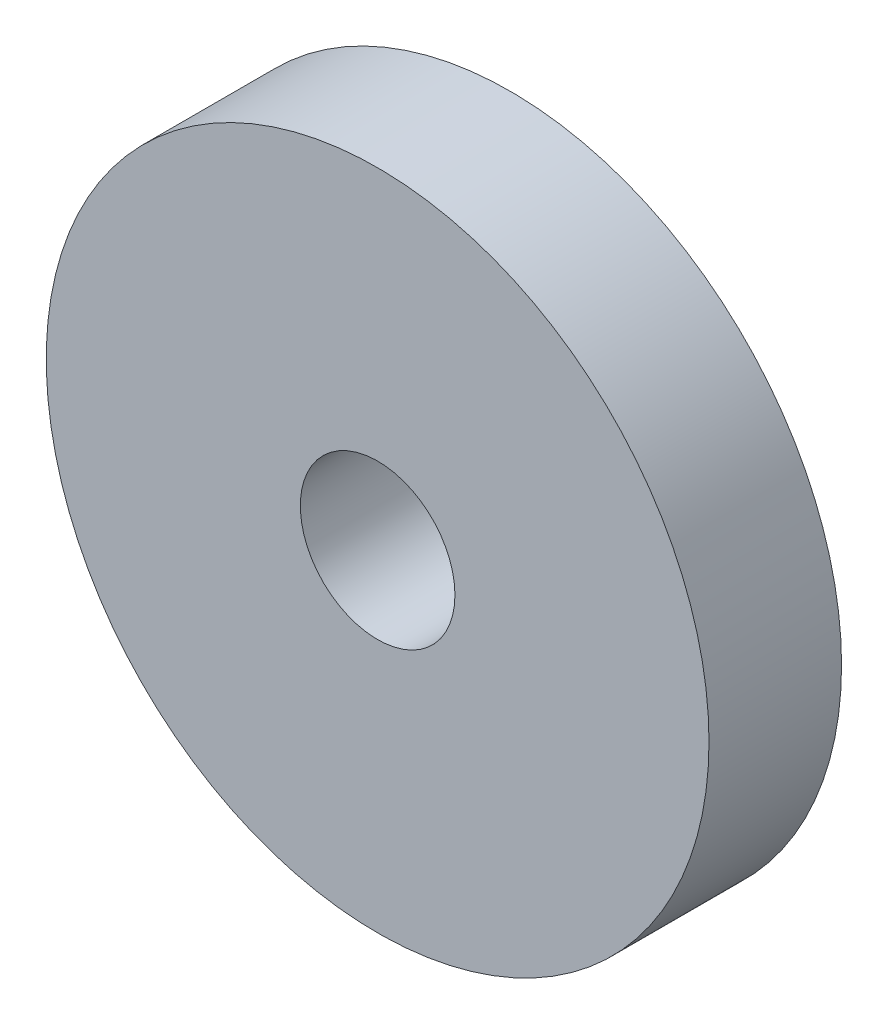
ISO-10303-21;
HEADER;
FILE_DESCRIPTION(('STEP AP214'),'2;1');
FILE_NAME('part.step','',(''),(''),'','','');
FILE_SCHEMA(('AUTOMOTIVE_DESIGN { 1 0 10303 214 1 1 1 1 }'));
ENDSEC;
DATA;
#1=APPLICATION_CONTEXT('core data for automotive mechanical design processes');
#2=APPLICATION_PROTOCOL_DEFINITION('international standard','automotive_design',2000,#1);
#3=PRODUCT_CONTEXT('',#1,'mechanical');
#4=PRODUCT('Part','Part','',(#3));
#5=PRODUCT_RELATED_PRODUCT_CATEGORY('part','',(#4));
#6=PRODUCT_DEFINITION_FORMATION('','',#4);
#7=PRODUCT_DEFINITION_CONTEXT('part definition',#1,'design');
#8=PRODUCT_DEFINITION('design','',#6,#7);
#9=PRODUCT_DEFINITION_SHAPE('','',#8);
#10=(LENGTH_UNIT() NAMED_UNIT(*) SI_UNIT(.MILLI.,.METRE.));
#11=(NAMED_UNIT(*) PLANE_ANGLE_UNIT() SI_UNIT($,.RADIAN.));
#12=(NAMED_UNIT(*) SI_UNIT($,.STERADIAN.) SOLID_ANGLE_UNIT());
#13=UNCERTAINTY_MEASURE_WITH_UNIT(LENGTH_MEASURE(1.E-05),#10,'distance_accuracy_value','');
#14=(GEOMETRIC_REPRESENTATION_CONTEXT(3) GLOBAL_UNCERTAINTY_ASSIGNED_CONTEXT((#13)) GLOBAL_UNIT_ASSIGNED_CONTEXT((#10,
#11,#12)) REPRESENTATION_CONTEXT('',''));
#15=CARTESIAN_POINT('',(0.,0.,0.));
#16=DIRECTION('',(0.,0.,1.));
#17=DIRECTION('',(1.,0.,0.));
#18=AXIS2_PLACEMENT_3D('',#15,#16,#17);
#19=CARTESIAN_POINT('',(0.,0.,3.));
#20=DIRECTION('',(0.,0.,1.));
#21=DIRECTION('',(1.,0.,0.));
#22=AXIS2_PLACEMENT_3D('',#19,#20,#21);
#23=PLANE('',#22);
#24=CARTESIAN_POINT('',(0.,0.,3.));
#25=DIRECTION('',(0.,0.,1.));
#26=DIRECTION('',(1.,0.,0.));
#27=AXIS2_PLACEMENT_3D('',#24,#25,#26);
#28=CIRCLE('',#27,7.5);
#29=CARTESIAN_POINT('',(7.5,0.,3.));
#30=VERTEX_POINT('',#29);
#31=EDGE_CURVE('E10',#30,#30,#28,.T.);
#32=ORIENTED_EDGE('',*,*,#31,.T.);
#33=EDGE_LOOP('',(#32));
#34=FACE_BOUND('',#33,.T.);
#35=CARTESIAN_POINT('',(0.,0.,3.));
#36=DIRECTION('',(0.,0.,1.));
#37=DIRECTION('',(1.,0.,0.));
#38=AXIS2_PLACEMENT_3D('',#35,#36,#37);
#39=CIRCLE('',#38,1.75);
#40=CARTESIAN_POINT('',(1.75,0.,3.));
#41=VERTEX_POINT('',#40);
#42=EDGE_CURVE('E56',#41,#41,#39,.T.);
#43=ORIENTED_EDGE('',*,*,#42,.F.);
#44=EDGE_LOOP('',(#43));
#45=FACE_BOUND('',#44,.T.);
#46=ADVANCED_FACE('F43',(#34,#45),#23,.T.);
#47=CARTESIAN_POINT('',(0.,0.,0.));
#48=DIRECTION('',(0.,0.,1.));
#49=DIRECTION('',(1.,0.,0.));
#50=AXIS2_PLACEMENT_3D('',#47,#48,#49);
#51=PLANE('',#50);
#52=CARTESIAN_POINT('',(0.,0.,0.));
#53=DIRECTION('',(0.,0.,1.));
#54=DIRECTION('',(1.,0.,0.));
#55=AXIS2_PLACEMENT_3D('',#52,#53,#54);
#56=CIRCLE('',#55,7.5);
#57=CARTESIAN_POINT('',(7.5,0.,0.));
#58=VERTEX_POINT('',#57);
#59=EDGE_CURVE('E47',#58,#58,#56,.T.);
#60=ORIENTED_EDGE('',*,*,#59,.F.);
#61=EDGE_LOOP('',(#60));
#62=FACE_BOUND('',#61,.T.);
#63=CARTESIAN_POINT('',(0.,0.,0.));
#64=DIRECTION('',(0.,0.,1.));
#65=DIRECTION('',(1.,0.,0.));
#66=AXIS2_PLACEMENT_3D('',#63,#64,#65);
#67=CIRCLE('',#66,1.75);
#68=CARTESIAN_POINT('',(1.75,0.,0.));
#69=VERTEX_POINT('',#68);
#70=EDGE_CURVE('E58',#69,#69,#67,.T.);
#71=ORIENTED_EDGE('',*,*,#70,.T.);
#72=EDGE_LOOP('',(#71));
#73=FACE_BOUND('',#72,.T.);
#74=ADVANCED_FACE('F70',(#62,#73),#51,.F.);
#75=CARTESIAN_POINT('',(0.,0.,3.));
#76=DIRECTION('',(0.,0.,-1.));
#77=DIRECTION('',(-1.,0.,0.));
#78=AXIS2_PLACEMENT_3D('',#75,#76,#77);
#79=CYLINDRICAL_SURFACE('',#78,7.5);
#80=ORIENTED_EDGE('',*,*,#31,.F.);
#81=EDGE_LOOP('',(#80));
#82=FACE_BOUND('',#81,.T.);
#83=ORIENTED_EDGE('',*,*,#59,.T.);
#84=EDGE_LOOP('',(#83));
#85=FACE_BOUND('',#84,.T.);
#86=ADVANCED_FACE('F45',(#82,#85),#79,.T.);
#87=CARTESIAN_POINT('',(0.,0.,3.));
#88=DIRECTION('',(0.,0.,-1.));
#89=DIRECTION('',(-1.,0.,0.));
#90=AXIS2_PLACEMENT_3D('',#87,#88,#89);
#91=CYLINDRICAL_SURFACE('',#90,1.75);
#92=ORIENTED_EDGE('',*,*,#42,.T.);
#93=EDGE_LOOP('',(#92));
#94=FACE_BOUND('',#93,.T.);
#95=ORIENTED_EDGE('',*,*,#70,.F.);
#96=EDGE_LOOP('',(#95));
#97=FACE_BOUND('',#96,.T.);
#98=ADVANCED_FACE('F66',(#94,#97),#91,.F.);
#99=CLOSED_SHELL('',(#46,#74,#86,#98));
#100=MANIFOLD_SOLID_BREP('B2',#99);
#101=ADVANCED_BREP_SHAPE_REPRESENTATION('',(#18,#100),#14);
#102=SHAPE_DEFINITION_REPRESENTATION(#9,#101);
ENDSEC;
END-ISO-10303-21;
